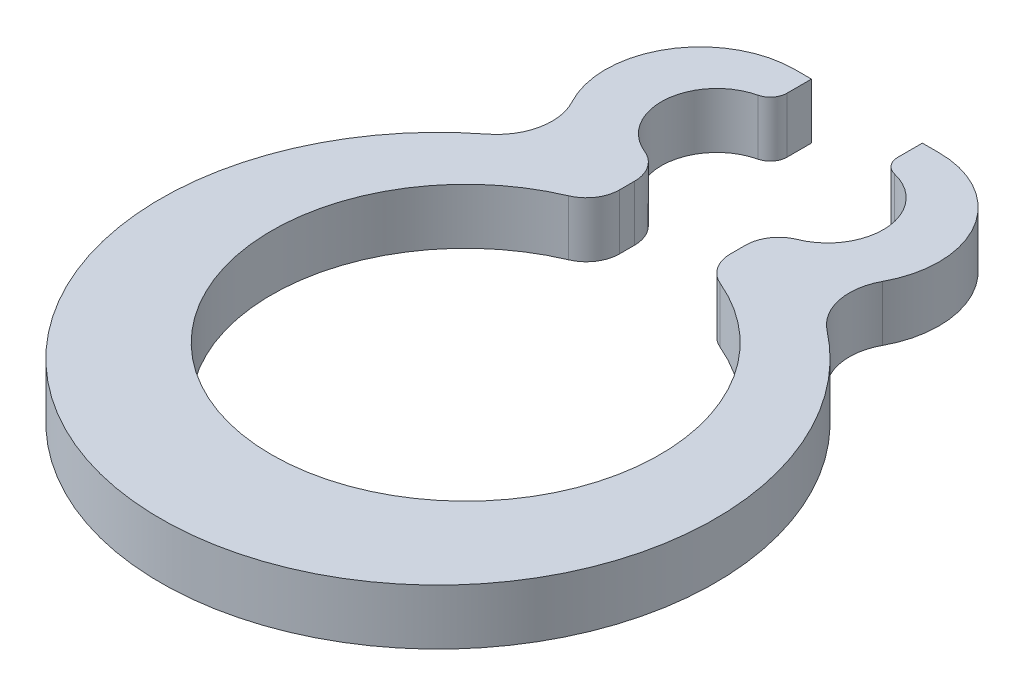
ISO-10303-21;
HEADER;
FILE_DESCRIPTION(('STEP AP214'),'2;1');
FILE_NAME('part.step','',(''),(''),'','','');
FILE_SCHEMA(('AUTOMOTIVE_DESIGN { 1 0 10303 214 1 1 1 1 }'));
ENDSEC;
DATA;
#1=APPLICATION_CONTEXT('core data for automotive mechanical design processes');
#2=APPLICATION_PROTOCOL_DEFINITION('international standard','automotive_design',2000,#1);
#3=PRODUCT_CONTEXT('',#1,'mechanical');
#4=PRODUCT('Part','Part','',(#3));
#5=PRODUCT_RELATED_PRODUCT_CATEGORY('part','',(#4));
#6=PRODUCT_DEFINITION_FORMATION('','',#4);
#7=PRODUCT_DEFINITION_CONTEXT('part definition',#1,'design');
#8=PRODUCT_DEFINITION('design','',#6,#7);
#9=PRODUCT_DEFINITION_SHAPE('','',#8);
#10=(LENGTH_UNIT() NAMED_UNIT(*) SI_UNIT(.MILLI.,.METRE.));
#11=(NAMED_UNIT(*) PLANE_ANGLE_UNIT() SI_UNIT($,.RADIAN.));
#12=(NAMED_UNIT(*) SI_UNIT($,.STERADIAN.) SOLID_ANGLE_UNIT());
#13=UNCERTAINTY_MEASURE_WITH_UNIT(LENGTH_MEASURE(1.E-05),#10,'distance_accuracy_value','');
#14=(GEOMETRIC_REPRESENTATION_CONTEXT(3) GLOBAL_UNCERTAINTY_ASSIGNED_CONTEXT((#13)) GLOBAL_UNIT_ASSIGNED_CONTEXT((#10,
#11,#12)) REPRESENTATION_CONTEXT('',''));
#15=CARTESIAN_POINT('',(0.,0.,0.));
#16=DIRECTION('',(0.,0.,1.));
#17=DIRECTION('',(1.,0.,0.));
#18=AXIS2_PLACEMENT_3D('',#15,#16,#17);
#19=CARTESIAN_POINT('',(-0.65,0.5,-3.6172697343063));
#20=DIRECTION('',(0.,0.,1.));
#21=DIRECTION('',(1.,0.,0.));
#22=AXIS2_PLACEMENT_3D('',#19,#20,#21);
#23=PLANE('',#22);
#24=DIRECTION('',(-1.,0.,0.));
#25=VECTOR('',#24,1.);
#26=CARTESIAN_POINT('',(-0.65,0.,-3.6172697343063));
#27=LINE('',#26,#25);
#28=CARTESIAN_POINT('',(-0.5,0.,-3.6172697343063));
#29=VERTEX_POINT('',#28);
#30=CARTESIAN_POINT('',(-0.65,0.,-3.6172697343063));
#31=VERTEX_POINT('',#30);
#32=EDGE_CURVE('E212',#29,#31,#27,.T.);
#33=ORIENTED_EDGE('',*,*,#32,.T.);
#34=DIRECTION('',(0.,-1.,0.));
#35=VECTOR('',#34,1.);
#36=CARTESIAN_POINT('',(-0.65,0.5,-3.6172697343063));
#37=LINE('',#36,#35);
#38=CARTESIAN_POINT('',(-0.65,0.5,-3.6172697343063));
#39=VERTEX_POINT('',#38);
#40=EDGE_CURVE('E11',#39,#31,#37,.T.);
#41=ORIENTED_EDGE('',*,*,#40,.F.);
#42=DIRECTION('',(-1.,0.,0.));
#43=VECTOR('',#42,1.);
#44=CARTESIAN_POINT('',(-0.65,0.5,-3.6172697343063));
#45=LINE('',#44,#43);
#46=CARTESIAN_POINT('',(-0.5,0.5,-3.6172697343063));
#47=VERTEX_POINT('',#46);
#48=EDGE_CURVE('E270',#47,#39,#45,.T.);
#49=ORIENTED_EDGE('',*,*,#48,.F.);
#50=DIRECTION('',(0.,-1.,0.));
#51=VECTOR('',#50,1.);
#52=CARTESIAN_POINT('',(-0.5,0.5,-3.6172697343063));
#53=LINE('',#52,#51);
#54=EDGE_CURVE('E208',#47,#29,#53,.T.);
#55=ORIENTED_EDGE('',*,*,#54,.T.);
#56=EDGE_LOOP('',(#33,#41,#49,#55));
#57=FACE_BOUND('',#56,.T.);
#58=ADVANCED_FACE('F39',(#57),#23,.F.);
#59=CARTESIAN_POINT('',(-0.65,0.5,-2.76407935800148));
#60=DIRECTION('',(0.,-1.,0.));
#61=DIRECTION('',(0.,0.,-1.));
#62=AXIS2_PLACEMENT_3D('',#59,#60,#61);
#63=CYLINDRICAL_SURFACE('',#62,0.853190376304816);
#64=CARTESIAN_POINT('',(-0.65,0.,-2.76407935800148));
#65=DIRECTION('',(0.,1.,0.));
#66=DIRECTION('',(0.,0.,1.));
#67=AXIS2_PLACEMENT_3D('',#64,#65,#66);
#68=CIRCLE('',#67,0.853190376304816);
#69=CARTESIAN_POINT('',(-1.40020629242879,0.,-2.35772441830048));
#70=VERTEX_POINT('',#69);
#71=EDGE_CURVE('E216',#31,#70,#68,.T.);
#72=ORIENTED_EDGE('',*,*,#71,.T.);
#73=DIRECTION('',(0.,-1.,0.));
#74=VECTOR('',#73,1.);
#75=CARTESIAN_POINT('',(-1.40020629242879,0.5,-2.35772441830048));
#76=LINE('',#75,#74);
#77=CARTESIAN_POINT('',(-1.40020629242879,0.5,-2.35772441830048));
#78=VERTEX_POINT('',#77);
#79=EDGE_CURVE('E48',#78,#70,#76,.T.);
#80=ORIENTED_EDGE('',*,*,#79,.F.);
#81=CARTESIAN_POINT('',(-0.65,0.5,-2.76407935800148));
#82=DIRECTION('',(0.,1.,0.));
#83=DIRECTION('',(0.,0.,1.));
#84=AXIS2_PLACEMENT_3D('',#81,#82,#83);
#85=CIRCLE('',#84,0.853190376304816);
#86=EDGE_CURVE('E135',#39,#78,#85,.T.);
#87=ORIENTED_EDGE('',*,*,#86,.F.);
#88=ORIENTED_EDGE('',*,*,#40,.T.);
#89=EDGE_LOOP('',(#72,#80,#87,#88));
#90=FACE_BOUND('',#89,.T.);
#91=ADVANCED_FACE('F420',(#90),#63,.T.);
#92=CARTESIAN_POINT('',(-1.83985394508865,0.5,-2.11958592600938));
#93=DIRECTION('',(0.,-1.,0.));
#94=DIRECTION('',(0.,0.,-1.));
#95=AXIS2_PLACEMENT_3D('',#92,#93,#94);
#96=CYLINDRICAL_SURFACE('',#95,0.5);
#97=CARTESIAN_POINT('',(-1.83985394508865,0.,-2.11958592600938));
#98=DIRECTION('',(0.,-1.,0.));
#99=DIRECTION('',(0.,0.,-1.));
#100=AXIS2_PLACEMENT_3D('',#97,#98,#99);
#101=CIRCLE('',#100,0.5);
#102=CARTESIAN_POINT('',(-1.5332116209072,0.,-1.72465493834115));
#103=VERTEX_POINT('',#102);
#104=EDGE_CURVE('E219',#70,#103,#101,.T.);
#105=ORIENTED_EDGE('',*,*,#104,.T.);
#106=DIRECTION('',(0.,-1.,0.));
#107=VECTOR('',#106,1.);
#108=CARTESIAN_POINT('',(-1.5332116209072,0.5,-1.72465493834115));
#109=LINE('',#108,#107);
#110=CARTESIAN_POINT('',(-1.5332116209072,0.5,-1.72465493834115));
#111=VERTEX_POINT('',#110);
#112=EDGE_CURVE('E329',#111,#103,#109,.T.);
#113=ORIENTED_EDGE('',*,*,#112,.F.);
#114=CARTESIAN_POINT('',(-1.83985394508865,0.5,-2.11958592600938));
#115=DIRECTION('',(0.,-1.,0.));
#116=DIRECTION('',(0.,0.,-1.));
#117=AXIS2_PLACEMENT_3D('',#114,#115,#116);
#118=CIRCLE('',#117,0.5);
#119=EDGE_CURVE('E339',#78,#111,#118,.T.);
#120=ORIENTED_EDGE('',*,*,#119,.F.);
#121=ORIENTED_EDGE('',*,*,#79,.T.);
#122=EDGE_LOOP('',(#105,#113,#120,#121));
#123=FACE_BOUND('',#122,.T.);
#124=ADVANCED_FACE('F337',(#123),#96,.F.);
#125=CARTESIAN_POINT('',(0.,0.5,0.25));
#126=DIRECTION('',(0.,-1.,0.));
#127=DIRECTION('',(0.,0.,-1.));
#128=AXIS2_PLACEMENT_3D('',#125,#126,#127);
#129=CYLINDRICAL_SURFACE('',#128,2.5);
#130=CARTESIAN_POINT('',(0.,0.,0.25));
#131=DIRECTION('',(0.,1.,0.));
#132=DIRECTION('',(0.,0.,1.));
#133=AXIS2_PLACEMENT_3D('',#130,#131,#132);
#134=CIRCLE('',#133,2.5);
#135=CARTESIAN_POINT('',(1.5332116209072,0.,-1.72465493834115));
#136=VERTEX_POINT('',#135);
#137=EDGE_CURVE('E222',#103,#136,#134,.T.);
#138=ORIENTED_EDGE('',*,*,#137,.T.);
#139=DIRECTION('',(0.,-1.,0.));
#140=VECTOR('',#139,1.);
#141=CARTESIAN_POINT('',(1.5332116209072,0.5,-1.72465493834115));
#142=LINE('',#141,#140);
#143=CARTESIAN_POINT('',(1.5332116209072,0.5,-1.72465493834115));
#144=VERTEX_POINT('',#143);
#145=EDGE_CURVE('E325',#144,#136,#142,.T.);
#146=ORIENTED_EDGE('',*,*,#145,.F.);
#147=CARTESIAN_POINT('',(0.,0.5,0.25));
#148=DIRECTION('',(0.,1.,0.));
#149=DIRECTION('',(0.,0.,1.));
#150=AXIS2_PLACEMENT_3D('',#147,#148,#149);
#151=CIRCLE('',#150,2.5);
#152=EDGE_CURVE('E358',#111,#144,#151,.T.);
#153=ORIENTED_EDGE('',*,*,#152,.F.);
#154=ORIENTED_EDGE('',*,*,#112,.T.);
#155=EDGE_LOOP('',(#138,#146,#153,#154));
#156=FACE_BOUND('',#155,.T.);
#157=ADVANCED_FACE('F348',(#156),#129,.T.);
#158=CARTESIAN_POINT('',(1.83985394508865,0.5,-2.11958592600938));
#159=DIRECTION('',(0.,-1.,0.));
#160=DIRECTION('',(0.,0.,-1.));
#161=AXIS2_PLACEMENT_3D('',#158,#159,#160);
#162=CYLINDRICAL_SURFACE('',#161,0.5);
#163=CARTESIAN_POINT('',(1.83985394508865,0.,-2.11958592600938));
#164=DIRECTION('',(0.,-1.,0.));
#165=DIRECTION('',(0.,0.,1.));
#166=AXIS2_PLACEMENT_3D('',#163,#164,#165);
#167=CIRCLE('',#166,0.5);
#168=CARTESIAN_POINT('',(1.40020629242879,0.,-2.35772441830048));
#169=VERTEX_POINT('',#168);
#170=EDGE_CURVE('E225',#136,#169,#167,.T.);
#171=ORIENTED_EDGE('',*,*,#170,.T.);
#172=DIRECTION('',(0.,-1.,0.));
#173=VECTOR('',#172,1.);
#174=CARTESIAN_POINT('',(1.40020629242879,0.5,-2.35772441830048));
#175=LINE('',#174,#173);
#176=CARTESIAN_POINT('',(1.40020629242879,0.5,-2.35772441830048));
#177=VERTEX_POINT('',#176);
#178=EDGE_CURVE('E321',#177,#169,#175,.T.);
#179=ORIENTED_EDGE('',*,*,#178,.F.);
#180=CARTESIAN_POINT('',(1.83985394508865,0.5,-2.11958592600938));
#181=DIRECTION('',(0.,-1.,0.));
#182=DIRECTION('',(0.,0.,1.));
#183=AXIS2_PLACEMENT_3D('',#180,#181,#182);
#184=CIRCLE('',#183,0.5);
#185=EDGE_CURVE('E354',#144,#177,#184,.T.);
#186=ORIENTED_EDGE('',*,*,#185,.F.);
#187=ORIENTED_EDGE('',*,*,#145,.T.);
#188=EDGE_LOOP('',(#171,#179,#186,#187));
#189=FACE_BOUND('',#188,.T.);
#190=ADVANCED_FACE('F352',(#189),#162,.F.);
#191=CARTESIAN_POINT('',(0.65,0.5,-2.76407935800148));
#192=DIRECTION('',(0.,-1.,0.));
#193=DIRECTION('',(0.,0.,-1.));
#194=AXIS2_PLACEMENT_3D('',#191,#192,#193);
#195=CYLINDRICAL_SURFACE('',#194,0.853190376304816);
#196=CARTESIAN_POINT('',(0.65,0.,-2.76407935800148));
#197=DIRECTION('',(0.,1.,0.));
#198=DIRECTION('',(0.,0.,1.));
#199=AXIS2_PLACEMENT_3D('',#196,#197,#198);
#200=CIRCLE('',#199,0.853190376304816);
#201=CARTESIAN_POINT('',(0.65,0.,-3.6172697343063));
#202=VERTEX_POINT('',#201);
#203=EDGE_CURVE('E228',#169,#202,#200,.T.);
#204=ORIENTED_EDGE('',*,*,#203,.T.);
#205=DIRECTION('',(0.,-1.,0.));
#206=VECTOR('',#205,1.);
#207=CARTESIAN_POINT('',(0.65,0.5,-3.6172697343063));
#208=LINE('',#207,#206);
#209=CARTESIAN_POINT('',(0.65,0.5,-3.6172697343063));
#210=VERTEX_POINT('',#209);
#211=EDGE_CURVE('E317',#210,#202,#208,.T.);
#212=ORIENTED_EDGE('',*,*,#211,.F.);
#213=CARTESIAN_POINT('',(0.65,0.5,-2.76407935800148));
#214=DIRECTION('',(0.,1.,0.));
#215=DIRECTION('',(0.,0.,1.));
#216=AXIS2_PLACEMENT_3D('',#213,#214,#215);
#217=CIRCLE('',#216,0.853190376304816);
#218=EDGE_CURVE('E357',#177,#210,#217,.T.);
#219=ORIENTED_EDGE('',*,*,#218,.F.);
#220=ORIENTED_EDGE('',*,*,#178,.T.);
#221=EDGE_LOOP('',(#204,#212,#219,#220));
#222=FACE_BOUND('',#221,.T.);
#223=ADVANCED_FACE('F433',(#222),#195,.T.);
#224=CARTESIAN_POINT('',(0.5,0.5,-3.6172697343063));
#225=DIRECTION('',(0.,0.,1.));
#226=DIRECTION('',(1.,0.,0.));
#227=AXIS2_PLACEMENT_3D('',#224,#225,#226);
#228=PLANE('',#227);
#229=DIRECTION('',(-1.,0.,0.));
#230=VECTOR('',#229,1.);
#231=CARTESIAN_POINT('',(0.5,0.,-3.6172697343063));
#232=LINE('',#231,#230);
#233=CARTESIAN_POINT('',(0.5,0.,-3.6172697343063));
#234=VERTEX_POINT('',#233);
#235=EDGE_CURVE('E231',#202,#234,#232,.T.);
#236=ORIENTED_EDGE('',*,*,#235,.T.);
#237=DIRECTION('',(0.,-1.,0.));
#238=VECTOR('',#237,1.);
#239=CARTESIAN_POINT('',(0.5,0.5,-3.6172697343063));
#240=LINE('',#239,#238);
#241=CARTESIAN_POINT('',(0.5,0.5,-3.6172697343063));
#242=VERTEX_POINT('',#241);
#243=EDGE_CURVE('E313',#242,#234,#240,.T.);
#244=ORIENTED_EDGE('',*,*,#243,.F.);
#245=DIRECTION('',(-1.,0.,0.));
#246=VECTOR('',#245,1.);
#247=CARTESIAN_POINT('',(0.5,0.5,-3.6172697343063));
#248=LINE('',#247,#246);
#249=EDGE_CURVE('E362',#210,#242,#248,.T.);
#250=ORIENTED_EDGE('',*,*,#249,.F.);
#251=ORIENTED_EDGE('',*,*,#211,.T.);
#252=EDGE_LOOP('',(#236,#244,#250,#251));
#253=FACE_BOUND('',#252,.T.);
#254=ADVANCED_FACE('F436',(#253),#228,.F.);
#255=CARTESIAN_POINT('',(0.5,0.5,-3.39653489003516));
#256=DIRECTION('',(1.,0.,0.));
#257=DIRECTION('',(0.,0.,-1.));
#258=AXIS2_PLACEMENT_3D('',#255,#256,#257);
#259=PLANE('',#258);
#260=DIRECTION('',(0.,0.,1.));
#261=VECTOR('',#260,1.);
#262=CARTESIAN_POINT('',(0.5,0.,-3.39653489003516));
#263=LINE('',#262,#261);
#264=CARTESIAN_POINT('',(0.5,0.,-3.39653489003516));
#265=VERTEX_POINT('',#264);
#266=EDGE_CURVE('E234',#234,#265,#263,.T.);
#267=ORIENTED_EDGE('',*,*,#266,.T.);
#268=DIRECTION('',(0.,-1.,0.));
#269=VECTOR('',#268,1.);
#270=CARTESIAN_POINT('',(0.5,0.5,-3.39653489003516));
#271=LINE('',#270,#269);
#272=CARTESIAN_POINT('',(0.5,0.5,-3.39653489003516));
#273=VERTEX_POINT('',#272);
#274=EDGE_CURVE('E309',#273,#265,#271,.T.);
#275=ORIENTED_EDGE('',*,*,#274,.F.);
#276=DIRECTION('',(0.,0.,1.));
#277=VECTOR('',#276,1.);
#278=CARTESIAN_POINT('',(0.5,0.5,-3.39653489003516));
#279=LINE('',#278,#277);
#280=EDGE_CURVE('E369',#242,#273,#279,.T.);
#281=ORIENTED_EDGE('',*,*,#280,.F.);
#282=ORIENTED_EDGE('',*,*,#243,.T.);
#283=EDGE_LOOP('',(#267,#275,#281,#282));
#284=FACE_BOUND('',#283,.T.);
#285=ADVANCED_FACE('F440',(#284),#259,.F.);
#286=CARTESIAN_POINT('',(0.65,0.5,-3.39653489003516));
#287=DIRECTION('',(0.,-1.,0.));
#288=DIRECTION('',(0.,0.,-1.));
#289=AXIS2_PLACEMENT_3D('',#286,#287,#288);
#290=CYLINDRICAL_SURFACE('',#289,0.15);
#291=CARTESIAN_POINT('',(0.65,0.,-3.39653489003516));
#292=DIRECTION('',(0.,1.,0.));
#293=DIRECTION('',(0.,0.,1.));
#294=AXIS2_PLACEMENT_3D('',#291,#292,#293);
#295=CIRCLE('',#294,0.15);
#296=CARTESIAN_POINT('',(0.615384615384615,0.,-3.250583613412));
#297=VERTEX_POINT('',#296);
#298=EDGE_CURVE('E237',#265,#297,#295,.T.);
#299=ORIENTED_EDGE('',*,*,#298,.T.);
#300=DIRECTION('',(0.,-1.,0.));
#301=VECTOR('',#300,1.);
#302=CARTESIAN_POINT('',(0.615384615384615,0.5,-3.250583613412));
#303=LINE('',#302,#301);
#304=CARTESIAN_POINT('',(0.615384615384615,0.5,-3.250583613412));
#305=VERTEX_POINT('',#304);
#306=EDGE_CURVE('E305',#305,#297,#303,.T.);
#307=ORIENTED_EDGE('',*,*,#306,.F.);
#308=CARTESIAN_POINT('',(0.65,0.5,-3.39653489003516));
#309=DIRECTION('',(0.,1.,0.));
#310=DIRECTION('',(0.,0.,1.));
#311=AXIS2_PLACEMENT_3D('',#308,#309,#310);
#312=CIRCLE('',#311,0.15);
#313=EDGE_CURVE('E372',#273,#305,#312,.T.);
#314=ORIENTED_EDGE('',*,*,#313,.F.);
#315=ORIENTED_EDGE('',*,*,#274,.T.);
#316=EDGE_LOOP('',(#299,#307,#314,#315));
#317=FACE_BOUND('',#316,.T.);
#318=ADVANCED_FACE('F444',(#317),#290,.T.);
#319=CARTESIAN_POINT('',(0.5,0.5,-2.76407935800148));
#320=DIRECTION('',(0.,-1.,0.));
#321=DIRECTION('',(0.,0.,-1.));
#322=AXIS2_PLACEMENT_3D('',#319,#320,#321);
#323=CYLINDRICAL_SURFACE('',#322,0.5);
#324=CARTESIAN_POINT('',(0.5,0.,-2.76407935800148));
#325=DIRECTION('',(0.,-1.,0.));
#326=DIRECTION('',(0.,0.,1.));
#327=AXIS2_PLACEMENT_3D('',#324,#325,#326);
#328=CIRCLE('',#327,0.5);
#329=CARTESIAN_POINT('',(0.6875,0.,-2.300566952558));
#330=VERTEX_POINT('',#329);
#331=EDGE_CURVE('E240',#297,#330,#328,.T.);
#332=ORIENTED_EDGE('',*,*,#331,.T.);
#333=DIRECTION('',(0.,-1.,0.));
#334=VECTOR('',#333,1.);
#335=CARTESIAN_POINT('',(0.6875,0.5,-2.300566952558));
#336=LINE('',#335,#334);
#337=CARTESIAN_POINT('',(0.6875,0.5,-2.300566952558));
#338=VERTEX_POINT('',#337);
#339=EDGE_CURVE('E301',#338,#330,#336,.T.);
#340=ORIENTED_EDGE('',*,*,#339,.F.);
#341=CARTESIAN_POINT('',(0.5,0.5,-2.76407935800148));
#342=DIRECTION('',(0.,-1.,0.));
#343=DIRECTION('',(0.,0.,1.));
#344=AXIS2_PLACEMENT_3D('',#341,#342,#343);
#345=CIRCLE('',#344,0.5);
#346=EDGE_CURVE('E375',#305,#338,#345,.T.);
#347=ORIENTED_EDGE('',*,*,#346,.F.);
#348=ORIENTED_EDGE('',*,*,#306,.T.);
#349=EDGE_LOOP('',(#332,#340,#347,#348));
#350=FACE_BOUND('',#349,.T.);
#351=ADVANCED_FACE('F448',(#350),#323,.F.);
#352=CARTESIAN_POINT('',(0.8,0.5,-2.02245950929191));
#353=DIRECTION('',(0.,-1.,0.));
#354=DIRECTION('',(0.,0.,-1.));
#355=AXIS2_PLACEMENT_3D('',#352,#353,#354);
#356=CYLINDRICAL_SURFACE('',#355,0.3);
#357=CARTESIAN_POINT('',(0.8,0.,-2.02245950929191));
#358=DIRECTION('',(0.,1.,0.));
#359=DIRECTION('',(0.,0.,-1.));
#360=AXIS2_PLACEMENT_3D('',#357,#358,#359);
#361=CIRCLE('',#360,0.3);
#362=CARTESIAN_POINT('',(0.5,0.,-2.02245950929191));
#363=VERTEX_POINT('',#362);
#364=EDGE_CURVE('E243',#330,#363,#361,.T.);
#365=ORIENTED_EDGE('',*,*,#364,.T.);
#366=DIRECTION('',(0.,-1.,0.));
#367=VECTOR('',#366,1.);
#368=CARTESIAN_POINT('',(0.5,0.5,-2.02245950929191));
#369=LINE('',#368,#367);
#370=CARTESIAN_POINT('',(0.5,0.5,-2.02245950929191));
#371=VERTEX_POINT('',#370);
#372=EDGE_CURVE('E297',#371,#363,#369,.T.);
#373=ORIENTED_EDGE('',*,*,#372,.F.);
#374=CARTESIAN_POINT('',(0.8,0.5,-2.02245950929191));
#375=DIRECTION('',(0.,1.,0.));
#376=DIRECTION('',(0.,0.,-1.));
#377=AXIS2_PLACEMENT_3D('',#374,#375,#376);
#378=CIRCLE('',#377,0.3);
#379=EDGE_CURVE('E378',#338,#371,#378,.T.);
#380=ORIENTED_EDGE('',*,*,#379,.F.);
#381=ORIENTED_EDGE('',*,*,#339,.T.);
#382=EDGE_LOOP('',(#365,#373,#380,#381));
#383=FACE_BOUND('',#382,.T.);
#384=ADVANCED_FACE('F452',(#383),#356,.T.);
#385=CARTESIAN_POINT('',(0.5,0.5,-1.88745860881769));
#386=DIRECTION('',(1.,0.,0.));
#387=DIRECTION('',(0.,0.,-1.));
#388=AXIS2_PLACEMENT_3D('',#385,#386,#387);
#389=PLANE('',#388);
#390=DIRECTION('',(0.,0.,1.));
#391=VECTOR('',#390,1.);
#392=CARTESIAN_POINT('',(0.5,0.,-1.88745860881769));
#393=LINE('',#392,#391);
#394=CARTESIAN_POINT('',(0.5,0.,-1.88745860881769));
#395=VERTEX_POINT('',#394);
#396=EDGE_CURVE('E246',#363,#395,#393,.T.);
#397=ORIENTED_EDGE('',*,*,#396,.T.);
#398=DIRECTION('',(0.,-1.,0.));
#399=VECTOR('',#398,1.);
#400=CARTESIAN_POINT('',(0.5,0.5,-1.88745860881769));
#401=LINE('',#400,#399);
#402=CARTESIAN_POINT('',(0.5,0.5,-1.88745860881769));
#403=VERTEX_POINT('',#402);
#404=EDGE_CURVE('E293',#403,#395,#401,.T.);
#405=ORIENTED_EDGE('',*,*,#404,.F.);
#406=DIRECTION('',(0.,0.,1.));
#407=VECTOR('',#406,1.);
#408=CARTESIAN_POINT('',(0.5,0.5,-1.88745860881769));
#409=LINE('',#408,#407);
#410=EDGE_CURVE('E381',#371,#403,#409,.T.);
#411=ORIENTED_EDGE('',*,*,#410,.F.);
#412=ORIENTED_EDGE('',*,*,#372,.T.);
#413=EDGE_LOOP('',(#397,#405,#411,#412));
#414=FACE_BOUND('',#413,.T.);
#415=ADVANCED_FACE('F456',(#414),#389,.F.);
#416=CARTESIAN_POINT('',(0.8,0.5,-1.88745860881769));
#417=DIRECTION('',(0.,-1.,0.));
#418=DIRECTION('',(0.,0.,-1.));
#419=AXIS2_PLACEMENT_3D('',#416,#417,#418);
#420=CYLINDRICAL_SURFACE('',#419,0.3);
#421=CARTESIAN_POINT('',(0.8,0.,-1.88745860881769));
#422=DIRECTION('',(0.,1.,0.));
#423=DIRECTION('',(0.,0.,1.));
#424=AXIS2_PLACEMENT_3D('',#421,#422,#423);
#425=CIRCLE('',#424,0.3);
#426=CARTESIAN_POINT('',(0.682926829268293,0.,-1.61124515386876));
#427=VERTEX_POINT('',#426);
#428=EDGE_CURVE('E249',#395,#427,#425,.T.);
#429=ORIENTED_EDGE('',*,*,#428,.T.);
#430=DIRECTION('',(0.,-1.,0.));
#431=VECTOR('',#430,1.);
#432=CARTESIAN_POINT('',(0.682926829268293,0.5,-1.61124515386876));
#433=LINE('',#432,#431);
#434=CARTESIAN_POINT('',(0.682926829268293,0.5,-1.61124515386876));
#435=VERTEX_POINT('',#434);
#436=EDGE_CURVE('E289',#435,#427,#433,.T.);
#437=ORIENTED_EDGE('',*,*,#436,.F.);
#438=CARTESIAN_POINT('',(0.8,0.5,-1.88745860881769));
#439=DIRECTION('',(0.,1.,0.));
#440=DIRECTION('',(0.,0.,1.));
#441=AXIS2_PLACEMENT_3D('',#438,#439,#440);
#442=CIRCLE('',#441,0.3);
#443=EDGE_CURVE('E384',#403,#435,#442,.T.);
#444=ORIENTED_EDGE('',*,*,#443,.F.);
#445=ORIENTED_EDGE('',*,*,#404,.T.);
#446=EDGE_LOOP('',(#429,#437,#444,#445));
#447=FACE_BOUND('',#446,.T.);
#448=ADVANCED_FACE('F460',(#447),#420,.T.);
#449=CARTESIAN_POINT('',(0.,0.5,0.));
#450=DIRECTION('',(0.,-1.,0.));
#451=DIRECTION('',(0.,0.,-1.));
#452=AXIS2_PLACEMENT_3D('',#449,#450,#451);
#453=CYLINDRICAL_SURFACE('',#452,1.75);
#454=CARTESIAN_POINT('',(0.,0.,0.));
#455=DIRECTION('',(0.,-1.,0.));
#456=DIRECTION('',(0.,0.,1.));
#457=AXIS2_PLACEMENT_3D('',#454,#455,#456);
#458=CIRCLE('',#457,1.75);
#459=CARTESIAN_POINT('',(-0.682926829268293,0.,-1.61124515386876));
#460=VERTEX_POINT('',#459);
#461=EDGE_CURVE('E252',#427,#460,#458,.T.);
#462=ORIENTED_EDGE('',*,*,#461,.T.);
#463=DIRECTION('',(0.,-1.,0.));
#464=VECTOR('',#463,1.);
#465=CARTESIAN_POINT('',(-0.682926829268293,0.5,-1.61124515386876));
#466=LINE('',#465,#464);
#467=CARTESIAN_POINT('',(-0.682926829268293,0.5,-1.61124515386876));
#468=VERTEX_POINT('',#467);
#469=EDGE_CURVE('E285',#468,#460,#466,.T.);
#470=ORIENTED_EDGE('',*,*,#469,.F.);
#471=CARTESIAN_POINT('',(0.,0.5,0.));
#472=DIRECTION('',(0.,-1.,0.));
#473=DIRECTION('',(0.,0.,1.));
#474=AXIS2_PLACEMENT_3D('',#471,#472,#473);
#475=CIRCLE('',#474,1.75);
#476=EDGE_CURVE('E387',#435,#468,#475,.T.);
#477=ORIENTED_EDGE('',*,*,#476,.F.);
#478=ORIENTED_EDGE('',*,*,#436,.T.);
#479=EDGE_LOOP('',(#462,#470,#477,#478));
#480=FACE_BOUND('',#479,.T.);
#481=ADVANCED_FACE('F464',(#480),#453,.F.);
#482=CARTESIAN_POINT('',(-0.8,0.5,-1.88745860881769));
#483=DIRECTION('',(0.,-1.,0.));
#484=DIRECTION('',(0.,0.,-1.));
#485=AXIS2_PLACEMENT_3D('',#482,#483,#484);
#486=CYLINDRICAL_SURFACE('',#485,0.3);
#487=CARTESIAN_POINT('',(-0.8,0.,-1.88745860881769));
#488=DIRECTION('',(0.,1.,0.));
#489=DIRECTION('',(0.,0.,-1.));
#490=AXIS2_PLACEMENT_3D('',#487,#488,#489);
#491=CIRCLE('',#490,0.3);
#492=CARTESIAN_POINT('',(-0.5,0.,-1.88745860881769));
#493=VERTEX_POINT('',#492);
#494=EDGE_CURVE('E255',#460,#493,#491,.T.);
#495=ORIENTED_EDGE('',*,*,#494,.T.);
#496=DIRECTION('',(0.,-1.,0.));
#497=VECTOR('',#496,1.);
#498=CARTESIAN_POINT('',(-0.5,0.5,-1.88745860881769));
#499=LINE('',#498,#497);
#500=CARTESIAN_POINT('',(-0.5,0.5,-1.88745860881769));
#501=VERTEX_POINT('',#500);
#502=EDGE_CURVE('E281',#501,#493,#499,.T.);
#503=ORIENTED_EDGE('',*,*,#502,.F.);
#504=CARTESIAN_POINT('',(-0.8,0.5,-1.88745860881769));
#505=DIRECTION('',(0.,1.,0.));
#506=DIRECTION('',(0.,0.,-1.));
#507=AXIS2_PLACEMENT_3D('',#504,#505,#506);
#508=CIRCLE('',#507,0.3);
#509=EDGE_CURVE('E390',#468,#501,#508,.T.);
#510=ORIENTED_EDGE('',*,*,#509,.F.);
#511=ORIENTED_EDGE('',*,*,#469,.T.);
#512=EDGE_LOOP('',(#495,#503,#510,#511));
#513=FACE_BOUND('',#512,.T.);
#514=ADVANCED_FACE('F468',(#513),#486,.T.);
#515=CARTESIAN_POINT('',(-0.5,0.5,-1.88745860881769));
#516=DIRECTION('',(-1.,0.,0.));
#517=DIRECTION('',(0.,0.,1.));
#518=AXIS2_PLACEMENT_3D('',#515,#516,#517);
#519=PLANE('',#518);
#520=DIRECTION('',(0.,0.,-1.));
#521=VECTOR('',#520,1.);
#522=CARTESIAN_POINT('',(-0.5,0.,-1.88745860881769));
#523=LINE('',#522,#521);
#524=CARTESIAN_POINT('',(-0.5,0.,-2.02245950929191));
#525=VERTEX_POINT('',#524);
#526=EDGE_CURVE('E258',#493,#525,#523,.T.);
#527=ORIENTED_EDGE('',*,*,#526,.T.);
#528=DIRECTION('',(0.,-1.,0.));
#529=VECTOR('',#528,1.);
#530=CARTESIAN_POINT('',(-0.5,0.5,-2.02245950929191));
#531=LINE('',#530,#529);
#532=CARTESIAN_POINT('',(-0.5,0.5,-2.02245950929191));
#533=VERTEX_POINT('',#532);
#534=EDGE_CURVE('E277',#533,#525,#531,.T.);
#535=ORIENTED_EDGE('',*,*,#534,.F.);
#536=DIRECTION('',(0.,0.,-1.));
#537=VECTOR('',#536,1.);
#538=CARTESIAN_POINT('',(-0.5,0.5,-1.88745860881769));
#539=LINE('',#538,#537);
#540=EDGE_CURVE('E393',#501,#533,#539,.T.);
#541=ORIENTED_EDGE('',*,*,#540,.F.);
#542=ORIENTED_EDGE('',*,*,#502,.T.);
#543=EDGE_LOOP('',(#527,#535,#541,#542));
#544=FACE_BOUND('',#543,.T.);
#545=ADVANCED_FACE('F401',(#544),#519,.F.);
#546=CARTESIAN_POINT('',(-0.8,0.5,-2.02245950929191));
#547=DIRECTION('',(0.,-1.,0.));
#548=DIRECTION('',(0.,0.,-1.));
#549=AXIS2_PLACEMENT_3D('',#546,#547,#548);
#550=CYLINDRICAL_SURFACE('',#549,0.3);
#551=CARTESIAN_POINT('',(-0.8,0.,-2.02245950929191));
#552=DIRECTION('',(0.,1.,0.));
#553=DIRECTION('',(0.,0.,1.));
#554=AXIS2_PLACEMENT_3D('',#551,#552,#553);
#555=CIRCLE('',#554,0.3);
#556=CARTESIAN_POINT('',(-0.6875,0.,-2.300566952558));
#557=VERTEX_POINT('',#556);
#558=EDGE_CURVE('E261',#525,#557,#555,.T.);
#559=ORIENTED_EDGE('',*,*,#558,.T.);
#560=DIRECTION('',(0.,-1.,0.));
#561=VECTOR('',#560,1.);
#562=CARTESIAN_POINT('',(-0.6875,0.5,-2.300566952558));
#563=LINE('',#562,#561);
#564=CARTESIAN_POINT('',(-0.6875,0.5,-2.300566952558));
#565=VERTEX_POINT('',#564);
#566=EDGE_CURVE('E201',#565,#557,#563,.T.);
#567=ORIENTED_EDGE('',*,*,#566,.F.);
#568=CARTESIAN_POINT('',(-0.8,0.5,-2.02245950929191));
#569=DIRECTION('',(0.,1.,0.));
#570=DIRECTION('',(0.,0.,1.));
#571=AXIS2_PLACEMENT_3D('',#568,#569,#570);
#572=CIRCLE('',#571,0.3);
#573=EDGE_CURVE('E190',#533,#565,#572,.T.);
#574=ORIENTED_EDGE('',*,*,#573,.F.);
#575=ORIENTED_EDGE('',*,*,#534,.T.);
#576=EDGE_LOOP('',(#559,#567,#574,#575));
#577=FACE_BOUND('',#576,.T.);
#578=ADVANCED_FACE('F405',(#577),#550,.T.);
#579=CARTESIAN_POINT('',(-0.5,0.5,-2.76407935800148));
#580=DIRECTION('',(0.,-1.,0.));
#581=DIRECTION('',(0.,0.,-1.));
#582=AXIS2_PLACEMENT_3D('',#579,#580,#581);
#583=CYLINDRICAL_SURFACE('',#582,0.5);
#584=CARTESIAN_POINT('',(-0.5,0.,-2.76407935800148));
#585=DIRECTION('',(0.,-1.,0.));
#586=DIRECTION('',(0.,0.,1.));
#587=AXIS2_PLACEMENT_3D('',#584,#585,#586);
#588=CIRCLE('',#587,0.5);
#589=CARTESIAN_POINT('',(-0.615384615384615,0.,-3.250583613412));
#590=VERTEX_POINT('',#589);
#591=EDGE_CURVE('E199',#557,#590,#588,.T.);
#592=ORIENTED_EDGE('',*,*,#591,.T.);
#593=DIRECTION('',(0.,-1.,0.));
#594=VECTOR('',#593,1.);
#595=CARTESIAN_POINT('',(-0.615384615384615,0.5,-3.250583613412));
#596=LINE('',#595,#594);
#597=CARTESIAN_POINT('',(-0.615384615384615,0.5,-3.250583613412));
#598=VERTEX_POINT('',#597);
#599=EDGE_CURVE('E196',#598,#590,#596,.T.);
#600=ORIENTED_EDGE('',*,*,#599,.F.);
#601=CARTESIAN_POINT('',(-0.5,0.5,-2.76407935800148));
#602=DIRECTION('',(0.,-1.,0.));
#603=DIRECTION('',(0.,0.,1.));
#604=AXIS2_PLACEMENT_3D('',#601,#602,#603);
#605=CIRCLE('',#604,0.5);
#606=EDGE_CURVE('E184',#565,#598,#605,.T.);
#607=ORIENTED_EDGE('',*,*,#606,.F.);
#608=ORIENTED_EDGE('',*,*,#566,.T.);
#609=EDGE_LOOP('',(#592,#600,#607,#608));
#610=FACE_BOUND('',#609,.T.);
#611=ADVANCED_FACE('F197',(#610),#583,.F.);
#612=CARTESIAN_POINT('',(-0.65,0.5,-3.39653489003516));
#613=DIRECTION('',(0.,-1.,0.));
#614=DIRECTION('',(0.,0.,-1.));
#615=AXIS2_PLACEMENT_3D('',#612,#613,#614);
#616=CYLINDRICAL_SURFACE('',#615,0.15);
#617=CARTESIAN_POINT('',(-0.65,0.,-3.39653489003516));
#618=DIRECTION('',(0.,1.,0.));
#619=DIRECTION('',(0.,0.,-1.));
#620=AXIS2_PLACEMENT_3D('',#617,#618,#619);
#621=CIRCLE('',#620,0.15);
#622=CARTESIAN_POINT('',(-0.5,0.,-3.39653489003516));
#623=VERTEX_POINT('',#622);
#624=EDGE_CURVE('E121',#590,#623,#621,.T.);
#625=ORIENTED_EDGE('',*,*,#624,.T.);
#626=DIRECTION('',(0.,-1.,0.));
#627=VECTOR('',#626,1.);
#628=CARTESIAN_POINT('',(-0.5,0.5,-3.39653489003516));
#629=LINE('',#628,#627);
#630=CARTESIAN_POINT('',(-0.5,0.5,-3.39653489003516));
#631=VERTEX_POINT('',#630);
#632=EDGE_CURVE('E202',#631,#623,#629,.T.);
#633=ORIENTED_EDGE('',*,*,#632,.F.);
#634=CARTESIAN_POINT('',(-0.65,0.5,-3.39653489003516));
#635=DIRECTION('',(0.,1.,0.));
#636=DIRECTION('',(0.,0.,-1.));
#637=AXIS2_PLACEMENT_3D('',#634,#635,#636);
#638=CIRCLE('',#637,0.15);
#639=EDGE_CURVE('E188',#598,#631,#638,.T.);
#640=ORIENTED_EDGE('',*,*,#639,.F.);
#641=ORIENTED_EDGE('',*,*,#599,.T.);
#642=EDGE_LOOP('',(#625,#633,#640,#641));
#643=FACE_BOUND('',#642,.T.);
#644=ADVANCED_FACE('F204',(#643),#616,.T.);
#645=CARTESIAN_POINT('',(-0.5,0.5,-3.39653489003516));
#646=DIRECTION('',(-1.,0.,0.));
#647=DIRECTION('',(0.,0.,1.));
#648=AXIS2_PLACEMENT_3D('',#645,#646,#647);
#649=PLANE('',#648);
#650=DIRECTION('',(0.,0.,-1.));
#651=VECTOR('',#650,1.);
#652=CARTESIAN_POINT('',(-0.5,0.,-3.39653489003516));
#653=LINE('',#652,#651);
#654=EDGE_CURVE('E127',#623,#29,#653,.T.);
#655=ORIENTED_EDGE('',*,*,#654,.T.);
#656=ORIENTED_EDGE('',*,*,#54,.F.);
#657=DIRECTION('',(0.,0.,-1.));
#658=VECTOR('',#657,1.);
#659=CARTESIAN_POINT('',(-0.5,0.5,-3.39653489003516));
#660=LINE('',#659,#658);
#661=EDGE_CURVE('E56',#631,#47,#660,.T.);
#662=ORIENTED_EDGE('',*,*,#661,.F.);
#663=ORIENTED_EDGE('',*,*,#632,.T.);
#664=EDGE_LOOP('',(#655,#656,#662,#663));
#665=FACE_BOUND('',#664,.T.);
#666=ADVANCED_FACE('F409',(#665),#649,.F.);
#667=CARTESIAN_POINT('',(-0.65,0.5,-3.39653489003516));
#668=DIRECTION('',(0.,-1.,0.));
#669=DIRECTION('',(0.,0.,-1.));
#670=AXIS2_PLACEMENT_3D('',#667,#668,#669);
#671=PLANE('',#670);
#672=ORIENTED_EDGE('',*,*,#48,.T.);
#673=ORIENTED_EDGE('',*,*,#86,.T.);
#674=ORIENTED_EDGE('',*,*,#119,.T.);
#675=ORIENTED_EDGE('',*,*,#152,.T.);
#676=ORIENTED_EDGE('',*,*,#185,.T.);
#677=ORIENTED_EDGE('',*,*,#218,.T.);
#678=ORIENTED_EDGE('',*,*,#249,.T.);
#679=ORIENTED_EDGE('',*,*,#280,.T.);
#680=ORIENTED_EDGE('',*,*,#313,.T.);
#681=ORIENTED_EDGE('',*,*,#346,.T.);
#682=ORIENTED_EDGE('',*,*,#379,.T.);
#683=ORIENTED_EDGE('',*,*,#410,.T.);
#684=ORIENTED_EDGE('',*,*,#443,.T.);
#685=ORIENTED_EDGE('',*,*,#476,.T.);
#686=ORIENTED_EDGE('',*,*,#509,.T.);
#687=ORIENTED_EDGE('',*,*,#540,.T.);
#688=ORIENTED_EDGE('',*,*,#573,.T.);
#689=ORIENTED_EDGE('',*,*,#606,.T.);
#690=ORIENTED_EDGE('',*,*,#639,.T.);
#691=ORIENTED_EDGE('',*,*,#661,.T.);
#692=EDGE_LOOP('',(#672,#673,#674,#675,#676,#677,#678,#679,#680,#681,#682,#683,#684,#685,#686,
#687,#688,#689,#690,#691));
#693=FACE_BOUND('',#692,.T.);
#694=ADVANCED_FACE('F186',(#693),#671,.F.);
#695=CARTESIAN_POINT('',(-0.65,0.,-3.39653489003516));
#696=DIRECTION('',(0.,-1.,0.));
#697=DIRECTION('',(0.,0.,-1.));
#698=AXIS2_PLACEMENT_3D('',#695,#696,#697);
#699=PLANE('',#698);
#700=ORIENTED_EDGE('',*,*,#32,.F.);
#701=ORIENTED_EDGE('',*,*,#654,.F.);
#702=ORIENTED_EDGE('',*,*,#624,.F.);
#703=ORIENTED_EDGE('',*,*,#591,.F.);
#704=ORIENTED_EDGE('',*,*,#558,.F.);
#705=ORIENTED_EDGE('',*,*,#526,.F.);
#706=ORIENTED_EDGE('',*,*,#494,.F.);
#707=ORIENTED_EDGE('',*,*,#461,.F.);
#708=ORIENTED_EDGE('',*,*,#428,.F.);
#709=ORIENTED_EDGE('',*,*,#396,.F.);
#710=ORIENTED_EDGE('',*,*,#364,.F.);
#711=ORIENTED_EDGE('',*,*,#331,.F.);
#712=ORIENTED_EDGE('',*,*,#298,.F.);
#713=ORIENTED_EDGE('',*,*,#266,.F.);
#714=ORIENTED_EDGE('',*,*,#235,.F.);
#715=ORIENTED_EDGE('',*,*,#203,.F.);
#716=ORIENTED_EDGE('',*,*,#170,.F.);
#717=ORIENTED_EDGE('',*,*,#137,.F.);
#718=ORIENTED_EDGE('',*,*,#104,.F.);
#719=ORIENTED_EDGE('',*,*,#71,.F.);
#720=EDGE_LOOP('',(#700,#701,#702,#703,#704,#705,#706,#707,#708,#709,#710,#711,#712,#713,#714,
#715,#716,#717,#718,#719));
#721=FACE_BOUND('',#720,.T.);
#722=ADVANCED_FACE('F343',(#721),#699,.T.);
#723=CLOSED_SHELL('',(#58,#91,#124,#157,#190,#223,#254,#285,#318,#351,#384,#415,#448,#481,#514,
#545,#578,#611,#644,#666,#694,#722));
#724=MANIFOLD_SOLID_BREP('B2',#723);
#725=ADVANCED_BREP_SHAPE_REPRESENTATION('',(#18,#724),#14);
#726=SHAPE_DEFINITION_REPRESENTATION(#9,#725);
ENDSEC;
END-ISO-10303-21;
